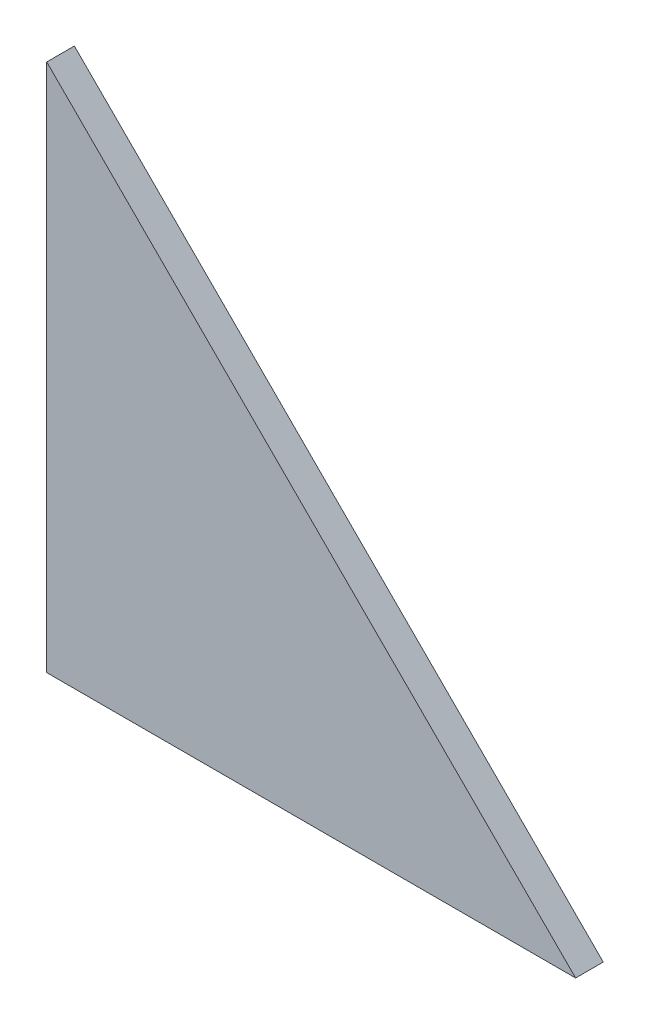
ISO-10303-21;
HEADER;
FILE_DESCRIPTION(('STEP AP214'),'2;1');
FILE_NAME('part.step','',(''),(''),'','','');
FILE_SCHEMA(('AUTOMOTIVE_DESIGN { 1 0 10303 214 1 1 1 1 }'));
ENDSEC;
DATA;
#1=APPLICATION_CONTEXT('core data for automotive mechanical design processes');
#2=APPLICATION_PROTOCOL_DEFINITION('international standard','automotive_design',2000,#1);
#3=PRODUCT_CONTEXT('',#1,'mechanical');
#4=PRODUCT('Part','Part','',(#3));
#5=PRODUCT_RELATED_PRODUCT_CATEGORY('part','',(#4));
#6=PRODUCT_DEFINITION_FORMATION('','',#4);
#7=PRODUCT_DEFINITION_CONTEXT('part definition',#1,'design');
#8=PRODUCT_DEFINITION('design','',#6,#7);
#9=PRODUCT_DEFINITION_SHAPE('','',#8);
#10=(LENGTH_UNIT() NAMED_UNIT(*) SI_UNIT(.MILLI.,.METRE.));
#11=(NAMED_UNIT(*) PLANE_ANGLE_UNIT() SI_UNIT($,.RADIAN.));
#12=(NAMED_UNIT(*) SI_UNIT($,.STERADIAN.) SOLID_ANGLE_UNIT());
#13=UNCERTAINTY_MEASURE_WITH_UNIT(LENGTH_MEASURE(1.E-05),#10,'distance_accuracy_value','');
#14=(GEOMETRIC_REPRESENTATION_CONTEXT(3) GLOBAL_UNCERTAINTY_ASSIGNED_CONTEXT((#13)) GLOBAL_UNIT_ASSIGNED_CONTEXT((#10,
#11,#12)) REPRESENTATION_CONTEXT('',''));
#15=CARTESIAN_POINT('',(0.,0.,0.));
#16=DIRECTION('',(0.,0.,1.));
#17=DIRECTION('',(1.,0.,0.));
#18=AXIS2_PLACEMENT_3D('',#15,#16,#17);
#19=CARTESIAN_POINT('',(383.,4.09394740330526E-12,20.));
#20=DIRECTION('',(0.,1.,0.));
#21=DIRECTION('',(-1.,0.,0.));
#22=AXIS2_PLACEMENT_3D('',#19,#20,#21);
#23=PLANE('',#22);
#24=DIRECTION('',(1.,0.,0.));
#25=VECTOR('',#24,1.);
#26=CARTESIAN_POINT('',(383.,4.09394740330526E-12,0.));
#27=LINE('',#26,#25);
#28=CARTESIAN_POINT('',(0.,0.,0.));
#29=VERTEX_POINT('',#28);
#30=CARTESIAN_POINT('',(383.,4.09394740330526E-12,0.));
#31=VERTEX_POINT('',#30);
#32=EDGE_CURVE('E97',#29,#31,#27,.T.);
#33=ORIENTED_EDGE('',*,*,#32,.T.);
#34=DIRECTION('',(0.,0.,-1.));
#35=VECTOR('',#34,1.);
#36=CARTESIAN_POINT('',(383.,4.09394740330526E-12,20.));
#37=LINE('',#36,#35);
#38=CARTESIAN_POINT('',(383.,4.09394740330526E-12,20.));
#39=VERTEX_POINT('',#38);
#40=EDGE_CURVE('E11',#39,#31,#37,.T.);
#41=ORIENTED_EDGE('',*,*,#40,.F.);
#42=DIRECTION('',(1.,0.,0.));
#43=VECTOR('',#42,1.);
#44=CARTESIAN_POINT('',(383.,4.09394740330526E-12,20.));
#45=LINE('',#44,#43);
#46=CARTESIAN_POINT('',(1.02695629777827E-12,0.,20.));
#47=VERTEX_POINT('',#46);
#48=EDGE_CURVE('E89',#47,#39,#45,.T.);
#49=ORIENTED_EDGE('',*,*,#48,.F.);
#50=DIRECTION('',(0.,0.,-1.));
#51=VECTOR('',#50,1.);
#52=CARTESIAN_POINT('',(1.02695629777827E-12,0.,20.));
#53=LINE('',#52,#51);
#54=EDGE_CURVE('E98',#47,#29,#53,.T.);
#55=ORIENTED_EDGE('',*,*,#54,.T.);
#56=EDGE_LOOP('',(#33,#41,#49,#55));
#57=FACE_BOUND('',#56,.T.);
#58=ADVANCED_FACE('F47',(#57),#23,.F.);
#59=CARTESIAN_POINT('',(4.10782519111308E-12,383.,20.));
#60=DIRECTION('',(-0.707106781186557,-0.707106781186557,0.));
#61=DIRECTION('',(0.707106781186538,-0.707106781186538,0.));
#62=AXIS2_PLACEMENT_3D('',#59,#60,#61);
#63=PLANE('',#62);
#64=DIRECTION('',(-0.707106781186538,0.707106781186538,0.));
#65=VECTOR('',#64,1.);
#66=CARTESIAN_POINT('',(3.30291349825984E-12,383.,0.));
#67=LINE('',#66,#65);
#68=CARTESIAN_POINT('',(3.30291349825984E-12,383.,0.));
#69=VERTEX_POINT('',#68);
#70=EDGE_CURVE('E76',#31,#69,#67,.T.);
#71=ORIENTED_EDGE('',*,*,#70,.T.);
#72=DIRECTION('',(0.,0.,-1.));
#73=VECTOR('',#72,1.);
#74=CARTESIAN_POINT('',(4.10782519111308E-12,383.,20.));
#75=LINE('',#74,#73);
#76=CARTESIAN_POINT('',(4.10782519111308E-12,383.,20.));
#77=VERTEX_POINT('',#76);
#78=EDGE_CURVE('E56',#77,#69,#75,.T.);
#79=ORIENTED_EDGE('',*,*,#78,.F.);
#80=DIRECTION('',(-0.707106781186538,0.707106781186538,0.));
#81=VECTOR('',#80,1.);
#82=CARTESIAN_POINT('',(4.10782519111308E-12,383.,20.));
#83=LINE('',#82,#81);
#84=EDGE_CURVE('E84',#39,#77,#83,.T.);
#85=ORIENTED_EDGE('',*,*,#84,.F.);
#86=ORIENTED_EDGE('',*,*,#40,.T.);
#87=EDGE_LOOP('',(#71,#79,#85,#86));
#88=FACE_BOUND('',#87,.T.);
#89=ADVANCED_FACE('F85',(#88),#63,.F.);
#90=CARTESIAN_POINT('',(1.02695629777827E-12,0.,20.));
#91=DIRECTION('',(1.,0.,0.));
#92=DIRECTION('',(0.,0.,-1.));
#93=AXIS2_PLACEMENT_3D('',#90,#91,#92);
#94=PLANE('',#93);
#95=DIRECTION('',(0.,-1.,0.));
#96=VECTOR('',#95,1.);
#97=CARTESIAN_POINT('',(0.,0.,0.));
#98=LINE('',#97,#96);
#99=EDGE_CURVE('E81',#69,#29,#98,.T.);
#100=ORIENTED_EDGE('',*,*,#99,.T.);
#101=ORIENTED_EDGE('',*,*,#54,.F.);
#102=DIRECTION('',(0.,-1.,0.));
#103=VECTOR('',#102,1.);
#104=CARTESIAN_POINT('',(1.02695629777827E-12,0.,20.));
#105=LINE('',#104,#103);
#106=EDGE_CURVE('E64',#77,#47,#105,.T.);
#107=ORIENTED_EDGE('',*,*,#106,.F.);
#108=ORIENTED_EDGE('',*,*,#78,.T.);
#109=EDGE_LOOP('',(#100,#101,#107,#108));
#110=FACE_BOUND('',#109,.T.);
#111=ADVANCED_FACE('F112',(#110),#94,.F.);
#112=CARTESIAN_POINT('',(1.02695629777827E-12,0.,20.));
#113=DIRECTION('',(0.,0.,-1.));
#114=DIRECTION('',(-1.,0.,0.));
#115=AXIS2_PLACEMENT_3D('',#112,#113,#114);
#116=PLANE('',#115);
#117=ORIENTED_EDGE('',*,*,#48,.T.);
#118=ORIENTED_EDGE('',*,*,#84,.T.);
#119=ORIENTED_EDGE('',*,*,#106,.T.);
#120=EDGE_LOOP('',(#117,#118,#119));
#121=FACE_BOUND('',#120,.T.);
#122=ADVANCED_FACE('F92',(#121),#116,.F.);
#123=CARTESIAN_POINT('',(0.,0.,0.));
#124=DIRECTION('',(0.,0.,-1.));
#125=DIRECTION('',(-1.,0.,0.));
#126=AXIS2_PLACEMENT_3D('',#123,#124,#125);
#127=PLANE('',#126);
#128=ORIENTED_EDGE('',*,*,#32,.F.);
#129=ORIENTED_EDGE('',*,*,#99,.F.);
#130=ORIENTED_EDGE('',*,*,#70,.F.);
#131=EDGE_LOOP('',(#128,#129,#130));
#132=FACE_BOUND('',#131,.T.);
#133=ADVANCED_FACE('F113',(#132),#127,.T.);
#134=CLOSED_SHELL('',(#58,#89,#111,#122,#133));
#135=MANIFOLD_SOLID_BREP('B2',#134);
#136=ADVANCED_BREP_SHAPE_REPRESENTATION('',(#18,#135),#14);
#137=SHAPE_DEFINITION_REPRESENTATION(#9,#136);
ENDSEC;
END-ISO-10303-21;
